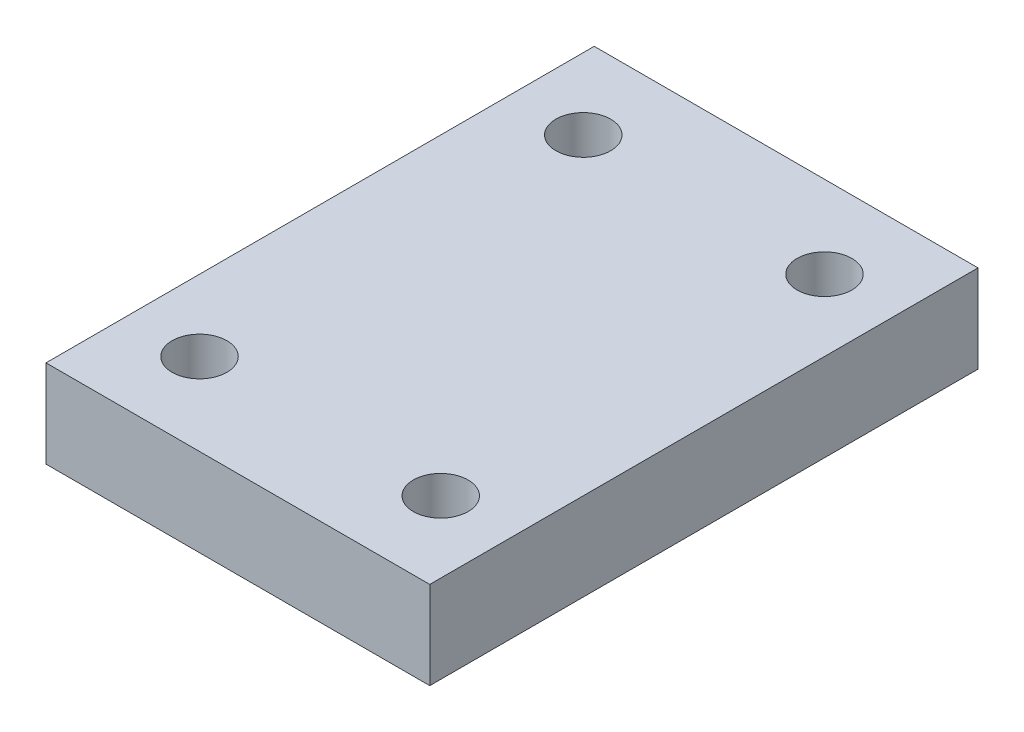
ISO-10303-21;
HEADER;
FILE_DESCRIPTION(('STEP AP214'),'2;1');
FILE_NAME('part.step','',(''),(''),'','','');
FILE_SCHEMA(('AUTOMOTIVE_DESIGN { 1 0 10303 214 1 1 1 1 }'));
ENDSEC;
DATA;
#1=APPLICATION_CONTEXT('core data for automotive mechanical design processes');
#2=APPLICATION_PROTOCOL_DEFINITION('international standard','automotive_design',2000,#1);
#3=PRODUCT_CONTEXT('',#1,'mechanical');
#4=PRODUCT('Part','Part','',(#3));
#5=PRODUCT_RELATED_PRODUCT_CATEGORY('part','',(#4));
#6=PRODUCT_DEFINITION_FORMATION('','',#4);
#7=PRODUCT_DEFINITION_CONTEXT('part definition',#1,'design');
#8=PRODUCT_DEFINITION('design','',#6,#7);
#9=PRODUCT_DEFINITION_SHAPE('','',#8);
#10=(LENGTH_UNIT() NAMED_UNIT(*) SI_UNIT(.MILLI.,.METRE.));
#11=(NAMED_UNIT(*) PLANE_ANGLE_UNIT() SI_UNIT($,.RADIAN.));
#12=(NAMED_UNIT(*) SI_UNIT($,.STERADIAN.) SOLID_ANGLE_UNIT());
#13=UNCERTAINTY_MEASURE_WITH_UNIT(LENGTH_MEASURE(1.E-05),#10,'distance_accuracy_value','');
#14=(GEOMETRIC_REPRESENTATION_CONTEXT(3) GLOBAL_UNCERTAINTY_ASSIGNED_CONTEXT((#13)) GLOBAL_UNIT_ASSIGNED_CONTEXT((#10,
#11,#12)) REPRESENTATION_CONTEXT('',''));
#15=CARTESIAN_POINT('',(0.,0.,0.));
#16=DIRECTION('',(0.,0.,1.));
#17=DIRECTION('',(1.,0.,0.));
#18=AXIS2_PLACEMENT_3D('',#15,#16,#17);
#19=CARTESIAN_POINT('',(0.,8.,0.));
#20=DIRECTION('',(0.,1.,0.));
#21=DIRECTION('',(0.,0.,1.));
#22=AXIS2_PLACEMENT_3D('',#19,#20,#21);
#23=PLANE('',#22);
#24=CARTESIAN_POINT('',(-11.,8.,-17.5));
#25=DIRECTION('',(0.,1.,0.));
#26=DIRECTION('',(0.,0.,1.));
#27=AXIS2_PLACEMENT_3D('',#24,#25,#26);
#28=CIRCLE('',#27,2.5);
#29=CARTESIAN_POINT('',(-11.,8.,-15.));
#30=VERTEX_POINT('',#29);
#31=EDGE_CURVE('E142',#30,#30,#28,.T.);
#32=ORIENTED_EDGE('',*,*,#31,.F.);
#33=EDGE_LOOP('',(#32));
#34=FACE_BOUND('',#33,.T.);
#35=CARTESIAN_POINT('',(11.,8.,-17.5));
#36=DIRECTION('',(0.,1.,0.));
#37=DIRECTION('',(0.,0.,1.));
#38=AXIS2_PLACEMENT_3D('',#35,#36,#37);
#39=CIRCLE('',#38,2.5);
#40=CARTESIAN_POINT('',(11.,8.,-15.));
#41=VERTEX_POINT('',#40);
#42=EDGE_CURVE('E112',#41,#41,#39,.T.);
#43=ORIENTED_EDGE('',*,*,#42,.F.);
#44=EDGE_LOOP('',(#43));
#45=FACE_BOUND('',#44,.T.);
#46=DIRECTION('',(0.,0.,-1.));
#47=VECTOR('',#46,1.);
#48=CARTESIAN_POINT('',(17.5,8.,-25.));
#49=LINE('',#48,#47);
#50=CARTESIAN_POINT('',(17.5,8.,25.));
#51=VERTEX_POINT('',#50);
#52=CARTESIAN_POINT('',(17.5,8.,-25.));
#53=VERTEX_POINT('',#52);
#54=EDGE_CURVE('E92',#51,#53,#49,.T.);
#55=ORIENTED_EDGE('',*,*,#54,.T.);
#56=DIRECTION('',(-1.,0.,0.));
#57=VECTOR('',#56,1.);
#58=CARTESIAN_POINT('',(-17.5,8.,-25.));
#59=LINE('',#58,#57);
#60=CARTESIAN_POINT('',(-17.5,8.,-25.));
#61=VERTEX_POINT('',#60);
#62=EDGE_CURVE('E87',#53,#61,#59,.T.);
#63=ORIENTED_EDGE('',*,*,#62,.T.);
#64=DIRECTION('',(0.,0.,1.));
#65=VECTOR('',#64,1.);
#66=CARTESIAN_POINT('',(-17.5,8.,-25.));
#67=LINE('',#66,#65);
#68=CARTESIAN_POINT('',(-17.5,8.,25.));
#69=VERTEX_POINT('',#68);
#70=EDGE_CURVE('E90',#61,#69,#67,.T.);
#71=ORIENTED_EDGE('',*,*,#70,.T.);
#72=DIRECTION('',(1.,0.,0.));
#73=VECTOR('',#72,1.);
#74=CARTESIAN_POINT('',(-17.5,8.,25.));
#75=LINE('',#74,#73);
#76=EDGE_CURVE('E57',#69,#51,#75,.T.);
#77=ORIENTED_EDGE('',*,*,#76,.T.);
#78=EDGE_LOOP('',(#55,#63,#71,#77));
#79=FACE_BOUND('',#78,.T.);
#80=CARTESIAN_POINT('',(11.,8.,17.5));
#81=DIRECTION('',(0.,1.,0.));
#82=DIRECTION('',(0.,0.,1.));
#83=AXIS2_PLACEMENT_3D('',#80,#81,#82);
#84=CIRCLE('',#83,2.5);
#85=CARTESIAN_POINT('',(11.,8.,20.));
#86=VERTEX_POINT('',#85);
#87=EDGE_CURVE('E134',#86,#86,#84,.T.);
#88=ORIENTED_EDGE('',*,*,#87,.F.);
#89=EDGE_LOOP('',(#88));
#90=FACE_BOUND('',#89,.T.);
#91=CARTESIAN_POINT('',(-11.,8.,17.5));
#92=DIRECTION('',(0.,1.,0.));
#93=DIRECTION('',(0.,0.,1.));
#94=AXIS2_PLACEMENT_3D('',#91,#92,#93);
#95=CIRCLE('',#94,2.5);
#96=CARTESIAN_POINT('',(-11.,8.,20.));
#97=VERTEX_POINT('',#96);
#98=EDGE_CURVE('E150',#97,#97,#95,.T.);
#99=ORIENTED_EDGE('',*,*,#98,.F.);
#100=EDGE_LOOP('',(#99));
#101=FACE_BOUND('',#100,.T.);
#102=ADVANCED_FACE('F39',(#34,#45,#79,#90,#101),#23,.T.);
#103=CARTESIAN_POINT('',(0.,0.,0.));
#104=DIRECTION('',(0.,1.,0.));
#105=DIRECTION('',(0.,0.,1.));
#106=AXIS2_PLACEMENT_3D('',#103,#104,#105);
#107=PLANE('',#106);
#108=DIRECTION('',(0.,0.,-1.));
#109=VECTOR('',#108,1.);
#110=CARTESIAN_POINT('',(17.5,0.,-25.));
#111=LINE('',#110,#109);
#112=CARTESIAN_POINT('',(17.5,0.,25.));
#113=VERTEX_POINT('',#112);
#114=CARTESIAN_POINT('',(17.5,0.,-25.));
#115=VERTEX_POINT('',#114);
#116=EDGE_CURVE('E108',#113,#115,#111,.T.);
#117=ORIENTED_EDGE('',*,*,#116,.F.);
#118=DIRECTION('',(1.,0.,0.));
#119=VECTOR('',#118,1.);
#120=CARTESIAN_POINT('',(-17.5,0.,25.));
#121=LINE('',#120,#119);
#122=CARTESIAN_POINT('',(-17.5,0.,25.));
#123=VERTEX_POINT('',#122);
#124=EDGE_CURVE('E80',#123,#113,#121,.T.);
#125=ORIENTED_EDGE('',*,*,#124,.F.);
#126=DIRECTION('',(0.,0.,1.));
#127=VECTOR('',#126,1.);
#128=CARTESIAN_POINT('',(-17.5,0.,-25.));
#129=LINE('',#128,#127);
#130=CARTESIAN_POINT('',(-17.5,0.,-25.));
#131=VERTEX_POINT('',#130);
#132=EDGE_CURVE('E74',#131,#123,#129,.T.);
#133=ORIENTED_EDGE('',*,*,#132,.F.);
#134=DIRECTION('',(-1.,0.,0.));
#135=VECTOR('',#134,1.);
#136=CARTESIAN_POINT('',(-17.5,0.,-25.));
#137=LINE('',#136,#135);
#138=EDGE_CURVE('E97',#115,#131,#137,.T.);
#139=ORIENTED_EDGE('',*,*,#138,.F.);
#140=EDGE_LOOP('',(#117,#125,#133,#139));
#141=FACE_BOUND('',#140,.T.);
#142=CARTESIAN_POINT('',(11.,0.,-17.5));
#143=DIRECTION('',(0.,1.,0.));
#144=DIRECTION('',(0.,0.,1.));
#145=AXIS2_PLACEMENT_3D('',#142,#143,#144);
#146=CIRCLE('',#145,2.5);
#147=CARTESIAN_POINT('',(11.,0.,-15.));
#148=VERTEX_POINT('',#147);
#149=EDGE_CURVE('E130',#148,#148,#146,.T.);
#150=ORIENTED_EDGE('',*,*,#149,.T.);
#151=EDGE_LOOP('',(#150));
#152=FACE_BOUND('',#151,.T.);
#153=CARTESIAN_POINT('',(11.,0.,17.5));
#154=DIRECTION('',(0.,1.,0.));
#155=DIRECTION('',(0.,0.,1.));
#156=AXIS2_PLACEMENT_3D('',#153,#154,#155);
#157=CIRCLE('',#156,2.5);
#158=CARTESIAN_POINT('',(11.,0.,20.));
#159=VERTEX_POINT('',#158);
#160=EDGE_CURVE('E138',#159,#159,#157,.T.);
#161=ORIENTED_EDGE('',*,*,#160,.T.);
#162=EDGE_LOOP('',(#161));
#163=FACE_BOUND('',#162,.T.);
#164=CARTESIAN_POINT('',(-11.,0.,-17.5));
#165=DIRECTION('',(0.,1.,0.));
#166=DIRECTION('',(0.,0.,1.));
#167=AXIS2_PLACEMENT_3D('',#164,#165,#166);
#168=CIRCLE('',#167,2.5);
#169=CARTESIAN_POINT('',(-11.,0.,-15.));
#170=VERTEX_POINT('',#169);
#171=EDGE_CURVE('E146',#170,#170,#168,.T.);
#172=ORIENTED_EDGE('',*,*,#171,.T.);
#173=EDGE_LOOP('',(#172));
#174=FACE_BOUND('',#173,.T.);
#175=CARTESIAN_POINT('',(-11.,0.,17.5));
#176=DIRECTION('',(0.,1.,0.));
#177=DIRECTION('',(0.,0.,1.));
#178=AXIS2_PLACEMENT_3D('',#175,#176,#177);
#179=CIRCLE('',#178,2.5);
#180=CARTESIAN_POINT('',(-11.,0.,20.));
#181=VERTEX_POINT('',#180);
#182=EDGE_CURVE('E154',#181,#181,#179,.T.);
#183=ORIENTED_EDGE('',*,*,#182,.T.);
#184=EDGE_LOOP('',(#183));
#185=FACE_BOUND('',#184,.T.);
#186=ADVANCED_FACE('F125',(#141,#152,#163,#174,#185),#107,.F.);
#187=CARTESIAN_POINT('',(17.5,8.,-25.));
#188=DIRECTION('',(-1.,0.,0.));
#189=DIRECTION('',(0.,0.,1.));
#190=AXIS2_PLACEMENT_3D('',#187,#188,#189);
#191=PLANE('',#190);
#192=ORIENTED_EDGE('',*,*,#116,.T.);
#193=DIRECTION('',(0.,-1.,0.));
#194=VECTOR('',#193,1.);
#195=CARTESIAN_POINT('',(17.5,8.,-25.));
#196=LINE('',#195,#194);
#197=EDGE_CURVE('E11',#53,#115,#196,.T.);
#198=ORIENTED_EDGE('',*,*,#197,.F.);
#199=ORIENTED_EDGE('',*,*,#54,.F.);
#200=DIRECTION('',(0.,-1.,0.));
#201=VECTOR('',#200,1.);
#202=CARTESIAN_POINT('',(17.5,8.,25.));
#203=LINE('',#202,#201);
#204=EDGE_CURVE('E104',#51,#113,#203,.T.);
#205=ORIENTED_EDGE('',*,*,#204,.T.);
#206=EDGE_LOOP('',(#192,#198,#199,#205));
#207=FACE_BOUND('',#206,.T.);
#208=ADVANCED_FACE('F41',(#207),#191,.F.);
#209=CARTESIAN_POINT('',(-17.5,8.,-25.));
#210=DIRECTION('',(0.,0.,1.));
#211=DIRECTION('',(1.,0.,0.));
#212=AXIS2_PLACEMENT_3D('',#209,#210,#211);
#213=PLANE('',#212);
#214=ORIENTED_EDGE('',*,*,#138,.T.);
#215=DIRECTION('',(0.,-1.,0.));
#216=VECTOR('',#215,1.);
#217=CARTESIAN_POINT('',(-17.5,8.,-25.));
#218=LINE('',#217,#216);
#219=EDGE_CURVE('E49',#61,#131,#218,.T.);
#220=ORIENTED_EDGE('',*,*,#219,.F.);
#221=ORIENTED_EDGE('',*,*,#62,.F.);
#222=ORIENTED_EDGE('',*,*,#197,.T.);
#223=EDGE_LOOP('',(#214,#220,#221,#222));
#224=FACE_BOUND('',#223,.T.);
#225=ADVANCED_FACE('F96',(#224),#213,.F.);
#226=CARTESIAN_POINT('',(-17.5,8.,-25.));
#227=DIRECTION('',(1.,0.,0.));
#228=DIRECTION('',(0.,0.,-1.));
#229=AXIS2_PLACEMENT_3D('',#226,#227,#228);
#230=PLANE('',#229);
#231=ORIENTED_EDGE('',*,*,#132,.T.);
#232=DIRECTION('',(0.,-1.,0.));
#233=VECTOR('',#232,1.);
#234=CARTESIAN_POINT('',(-17.5,8.,25.));
#235=LINE('',#234,#233);
#236=EDGE_CURVE('E99',#69,#123,#235,.T.);
#237=ORIENTED_EDGE('',*,*,#236,.F.);
#238=ORIENTED_EDGE('',*,*,#70,.F.);
#239=ORIENTED_EDGE('',*,*,#219,.T.);
#240=EDGE_LOOP('',(#231,#237,#238,#239));
#241=FACE_BOUND('',#240,.T.);
#242=ADVANCED_FACE('F100',(#241),#230,.F.);
#243=CARTESIAN_POINT('',(-17.5,8.,25.));
#244=DIRECTION('',(0.,0.,-1.));
#245=DIRECTION('',(-1.,0.,0.));
#246=AXIS2_PLACEMENT_3D('',#243,#244,#245);
#247=PLANE('',#246);
#248=ORIENTED_EDGE('',*,*,#124,.T.);
#249=ORIENTED_EDGE('',*,*,#204,.F.);
#250=ORIENTED_EDGE('',*,*,#76,.F.);
#251=ORIENTED_EDGE('',*,*,#236,.T.);
#252=EDGE_LOOP('',(#248,#249,#250,#251));
#253=FACE_BOUND('',#252,.T.);
#254=ADVANCED_FACE('F122',(#253),#247,.F.);
#255=CARTESIAN_POINT('',(11.,8.,-17.5));
#256=DIRECTION('',(0.,-1.,0.));
#257=DIRECTION('',(0.,0.,-1.));
#258=AXIS2_PLACEMENT_3D('',#255,#256,#257);
#259=CYLINDRICAL_SURFACE('',#258,2.5);
#260=ORIENTED_EDGE('',*,*,#42,.T.);
#261=EDGE_LOOP('',(#260));
#262=FACE_BOUND('',#261,.T.);
#263=ORIENTED_EDGE('',*,*,#149,.F.);
#264=EDGE_LOOP('',(#263));
#265=FACE_BOUND('',#264,.T.);
#266=ADVANCED_FACE('F175',(#262,#265),#259,.F.);
#267=CARTESIAN_POINT('',(11.,8.,17.5));
#268=DIRECTION('',(0.,-1.,0.));
#269=DIRECTION('',(0.,0.,-1.));
#270=AXIS2_PLACEMENT_3D('',#267,#268,#269);
#271=CYLINDRICAL_SURFACE('',#270,2.5);
#272=ORIENTED_EDGE('',*,*,#87,.T.);
#273=EDGE_LOOP('',(#272));
#274=FACE_BOUND('',#273,.T.);
#275=ORIENTED_EDGE('',*,*,#160,.F.);
#276=EDGE_LOOP('',(#275));
#277=FACE_BOUND('',#276,.T.);
#278=ADVANCED_FACE('F221',(#274,#277),#271,.F.);
#279=CARTESIAN_POINT('',(-11.,8.,-17.5));
#280=DIRECTION('',(0.,-1.,0.));
#281=DIRECTION('',(0.,0.,-1.));
#282=AXIS2_PLACEMENT_3D('',#279,#280,#281);
#283=CYLINDRICAL_SURFACE('',#282,2.5);
#284=ORIENTED_EDGE('',*,*,#31,.T.);
#285=EDGE_LOOP('',(#284));
#286=FACE_BOUND('',#285,.T.);
#287=ORIENTED_EDGE('',*,*,#171,.F.);
#288=EDGE_LOOP('',(#287));
#289=FACE_BOUND('',#288,.T.);
#290=ADVANCED_FACE('F229',(#286,#289),#283,.F.);
#291=CARTESIAN_POINT('',(-11.,8.,17.5));
#292=DIRECTION('',(0.,-1.,0.));
#293=DIRECTION('',(0.,0.,-1.));
#294=AXIS2_PLACEMENT_3D('',#291,#292,#293);
#295=CYLINDRICAL_SURFACE('',#294,2.5);
#296=ORIENTED_EDGE('',*,*,#98,.T.);
#297=EDGE_LOOP('',(#296));
#298=FACE_BOUND('',#297,.T.);
#299=ORIENTED_EDGE('',*,*,#182,.F.);
#300=EDGE_LOOP('',(#299));
#301=FACE_BOUND('',#300,.T.);
#302=ADVANCED_FACE('F162',(#298,#301),#295,.F.);
#303=CLOSED_SHELL('',(#102,#186,#208,#225,#242,#254,#266,#278,#290,#302));
#304=MANIFOLD_SOLID_BREP('B2',#303);
#305=ADVANCED_BREP_SHAPE_REPRESENTATION('',(#18,#304),#14);
#306=SHAPE_DEFINITION_REPRESENTATION(#9,#305);
ENDSEC;
END-ISO-10303-21;
